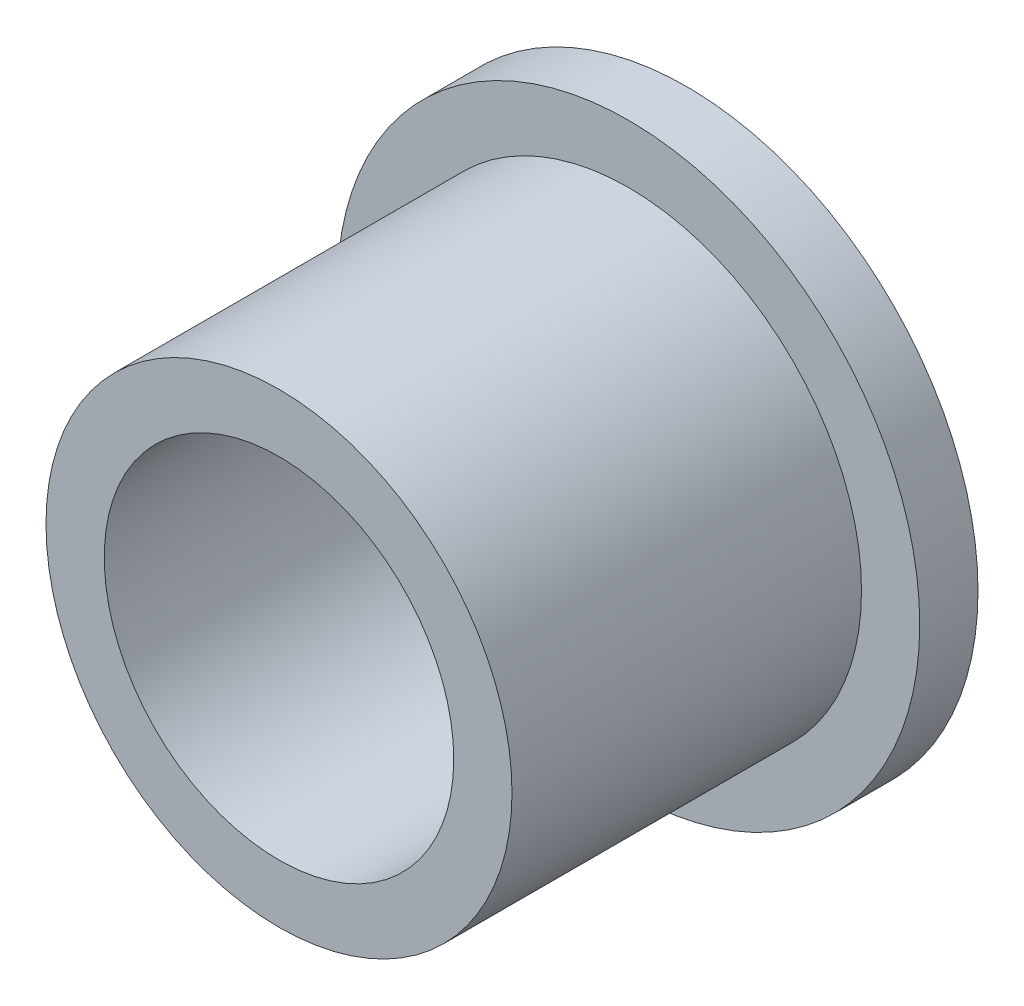
ISO-10303-21;
HEADER;
FILE_DESCRIPTION(('STEP AP214'),'2;1');
FILE_NAME('part.step','',(''),(''),'','','');
FILE_SCHEMA(('AUTOMOTIVE_DESIGN { 1 0 10303 214 1 1 1 1 }'));
ENDSEC;
DATA;
#1=APPLICATION_CONTEXT('core data for automotive mechanical design processes');
#2=APPLICATION_PROTOCOL_DEFINITION('international standard','automotive_design',2000,#1);
#3=PRODUCT_CONTEXT('',#1,'mechanical');
#4=PRODUCT('Part','Part','',(#3));
#5=PRODUCT_RELATED_PRODUCT_CATEGORY('part','',(#4));
#6=PRODUCT_DEFINITION_FORMATION('','',#4);
#7=PRODUCT_DEFINITION_CONTEXT('part definition',#1,'design');
#8=PRODUCT_DEFINITION('design','',#6,#7);
#9=PRODUCT_DEFINITION_SHAPE('','',#8);
#10=(LENGTH_UNIT() NAMED_UNIT(*) SI_UNIT(.MILLI.,.METRE.));
#11=(NAMED_UNIT(*) PLANE_ANGLE_UNIT() SI_UNIT($,.RADIAN.));
#12=(NAMED_UNIT(*) SI_UNIT($,.STERADIAN.) SOLID_ANGLE_UNIT());
#13=UNCERTAINTY_MEASURE_WITH_UNIT(LENGTH_MEASURE(1.E-05),#10,'distance_accuracy_value','');
#14=(GEOMETRIC_REPRESENTATION_CONTEXT(3) GLOBAL_UNCERTAINTY_ASSIGNED_CONTEXT((#13)) GLOBAL_UNIT_ASSIGNED_CONTEXT((#10,
#11,#12)) REPRESENTATION_CONTEXT('',''));
#15=CARTESIAN_POINT('',(0.,0.,0.));
#16=DIRECTION('',(0.,0.,1.));
#17=DIRECTION('',(1.,0.,0.));
#18=AXIS2_PLACEMENT_3D('',#15,#16,#17);
#19=CARTESIAN_POINT('',(0.,0.,3.));
#20=DIRECTION('',(0.,0.,-1.));
#21=DIRECTION('',(-1.,0.,0.));
#22=AXIS2_PLACEMENT_3D('',#19,#20,#21);
#23=CYLINDRICAL_SURFACE('',#22,15.);
#24=CARTESIAN_POINT('',(0.,0.,3.));
#25=DIRECTION('',(0.,0.,1.));
#26=DIRECTION('',(1.,0.,0.));
#27=AXIS2_PLACEMENT_3D('',#24,#25,#26);
#28=CIRCLE('',#27,15.);
#29=CARTESIAN_POINT('',(15.,0.,3.));
#30=VERTEX_POINT('',#29);
#31=EDGE_CURVE('E10',#30,#30,#28,.T.);
#32=ORIENTED_EDGE('',*,*,#31,.F.);
#33=EDGE_LOOP('',(#32));
#34=FACE_BOUND('',#33,.T.);
#35=CARTESIAN_POINT('',(0.,0.,0.));
#36=DIRECTION('',(0.,0.,1.));
#37=DIRECTION('',(1.,0.,0.));
#38=AXIS2_PLACEMENT_3D('',#35,#36,#37);
#39=CIRCLE('',#38,15.);
#40=CARTESIAN_POINT('',(15.,0.,0.));
#41=VERTEX_POINT('',#40);
#42=EDGE_CURVE('E34',#41,#41,#39,.T.);
#43=ORIENTED_EDGE('',*,*,#42,.T.);
#44=EDGE_LOOP('',(#43));
#45=FACE_BOUND('',#44,.T.);
#46=ADVANCED_FACE('F31',(#34,#45),#23,.T.);
#47=CARTESIAN_POINT('',(0.,0.,3.));
#48=DIRECTION('',(0.,0.,1.));
#49=DIRECTION('',(1.,0.,0.));
#50=AXIS2_PLACEMENT_3D('',#47,#48,#49);
#51=PLANE('',#50);
#52=CARTESIAN_POINT('',(0.,0.,3.));
#53=DIRECTION('',(0.,0.,1.));
#54=DIRECTION('',(1.,0.,0.));
#55=AXIS2_PLACEMENT_3D('',#52,#53,#54);
#56=CIRCLE('',#55,12.);
#57=CARTESIAN_POINT('',(12.,0.,3.));
#58=VERTEX_POINT('',#57);
#59=EDGE_CURVE('E43',#58,#58,#56,.T.);
#60=ORIENTED_EDGE('',*,*,#59,.F.);
#61=EDGE_LOOP('',(#60));
#62=FACE_BOUND('',#61,.T.);
#63=ORIENTED_EDGE('',*,*,#31,.T.);
#64=EDGE_LOOP('',(#63));
#65=FACE_BOUND('',#64,.T.);
#66=ADVANCED_FACE('F70',(#62,#65),#51,.T.);
#67=CARTESIAN_POINT('',(0.,0.,0.));
#68=DIRECTION('',(0.,0.,1.));
#69=DIRECTION('',(1.,0.,0.));
#70=AXIS2_PLACEMENT_3D('',#67,#68,#69);
#71=PLANE('',#70);
#72=CARTESIAN_POINT('',(0.,0.,0.));
#73=DIRECTION('',(0.,0.,1.));
#74=DIRECTION('',(1.,0.,0.));
#75=AXIS2_PLACEMENT_3D('',#72,#73,#74);
#76=CIRCLE('',#75,9.);
#77=CARTESIAN_POINT('',(9.,0.,0.));
#78=VERTEX_POINT('',#77);
#79=EDGE_CURVE('E46',#78,#78,#76,.F.);
#80=ORIENTED_EDGE('',*,*,#79,.F.);
#81=EDGE_LOOP('',(#80));
#82=FACE_BOUND('',#81,.T.);
#83=ORIENTED_EDGE('',*,*,#42,.F.);
#84=EDGE_LOOP('',(#83));
#85=FACE_BOUND('',#84,.T.);
#86=ADVANCED_FACE('F66',(#82,#85),#71,.F.);
#87=CARTESIAN_POINT('',(0.,0.,21.));
#88=DIRECTION('',(0.,0.,-1.));
#89=DIRECTION('',(-1.,0.,0.));
#90=AXIS2_PLACEMENT_3D('',#87,#88,#89);
#91=CYLINDRICAL_SURFACE('',#90,12.);
#92=CARTESIAN_POINT('',(0.,0.,21.));
#93=DIRECTION('',(0.,0.,1.));
#94=DIRECTION('',(1.,0.,0.));
#95=AXIS2_PLACEMENT_3D('',#92,#93,#94);
#96=CIRCLE('',#95,12.);
#97=CARTESIAN_POINT('',(12.,0.,21.));
#98=VERTEX_POINT('',#97);
#99=EDGE_CURVE('E41',#98,#98,#96,.T.);
#100=ORIENTED_EDGE('',*,*,#99,.F.);
#101=EDGE_LOOP('',(#100));
#102=FACE_BOUND('',#101,.T.);
#103=ORIENTED_EDGE('',*,*,#59,.T.);
#104=EDGE_LOOP('',(#103));
#105=FACE_BOUND('',#104,.T.);
#106=ADVANCED_FACE('F60',(#102,#105),#91,.T.);
#107=CARTESIAN_POINT('',(0.,0.,21.));
#108=DIRECTION('',(0.,0.,1.));
#109=DIRECTION('',(1.,0.,0.));
#110=AXIS2_PLACEMENT_3D('',#107,#108,#109);
#111=PLANE('',#110);
#112=CARTESIAN_POINT('',(0.,0.,21.));
#113=DIRECTION('',(0.,0.,1.));
#114=DIRECTION('',(1.,0.,0.));
#115=AXIS2_PLACEMENT_3D('',#112,#113,#114);
#116=CIRCLE('',#115,9.);
#117=CARTESIAN_POINT('',(9.,0.,21.));
#118=VERTEX_POINT('',#117);
#119=EDGE_CURVE('E51',#118,#118,#116,.T.);
#120=ORIENTED_EDGE('',*,*,#119,.F.);
#121=EDGE_LOOP('',(#120));
#122=FACE_BOUND('',#121,.T.);
#123=ORIENTED_EDGE('',*,*,#99,.T.);
#124=EDGE_LOOP('',(#123));
#125=FACE_BOUND('',#124,.T.);
#126=ADVANCED_FACE('F57',(#122,#125),#111,.T.);
#127=CARTESIAN_POINT('',(0.,0.,-25.4558441227157));
#128=DIRECTION('',(0.,0.,1.));
#129=DIRECTION('',(1.,0.,0.));
#130=AXIS2_PLACEMENT_3D('',#127,#128,#129);
#131=CYLINDRICAL_SURFACE('',#130,9.);
#132=ORIENTED_EDGE('',*,*,#79,.T.);
#133=EDGE_LOOP('',(#132));
#134=FACE_BOUND('',#133,.T.);
#135=ORIENTED_EDGE('',*,*,#119,.T.);
#136=EDGE_LOOP('',(#135));
#137=FACE_BOUND('',#136,.T.);
#138=ADVANCED_FACE('F55',(#134,#137),#131,.F.);
#139=CLOSED_SHELL('',(#46,#66,#86,#106,#126,#138));
#140=MANIFOLD_SOLID_BREP('B2',#139);
#141=ADVANCED_BREP_SHAPE_REPRESENTATION('',(#18,#140),#14);
#142=SHAPE_DEFINITION_REPRESENTATION(#9,#141);
ENDSEC;
END-ISO-10303-21;
